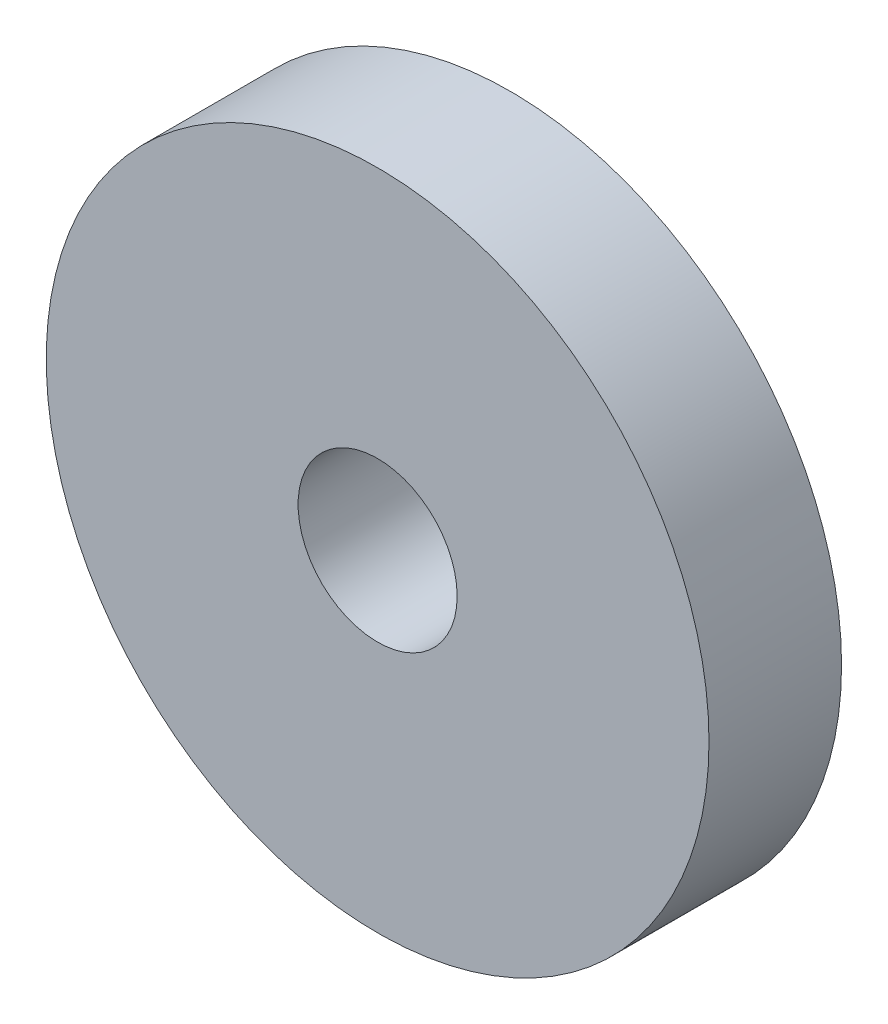
ISO-10303-21;
HEADER;
FILE_DESCRIPTION(('STEP AP214'),'2;1');
FILE_NAME('part.step','',(''),(''),'','','');
FILE_SCHEMA(('AUTOMOTIVE_DESIGN { 1 0 10303 214 1 1 1 1 }'));
ENDSEC;
DATA;
#1=APPLICATION_CONTEXT('core data for automotive mechanical design processes');
#2=APPLICATION_PROTOCOL_DEFINITION('international standard','automotive_design',2000,#1);
#3=PRODUCT_CONTEXT('',#1,'mechanical');
#4=PRODUCT('Part','Part','',(#3));
#5=PRODUCT_RELATED_PRODUCT_CATEGORY('part','',(#4));
#6=PRODUCT_DEFINITION_FORMATION('','',#4);
#7=PRODUCT_DEFINITION_CONTEXT('part definition',#1,'design');
#8=PRODUCT_DEFINITION('design','',#6,#7);
#9=PRODUCT_DEFINITION_SHAPE('','',#8);
#10=(LENGTH_UNIT() NAMED_UNIT(*) SI_UNIT(.MILLI.,.METRE.));
#11=(NAMED_UNIT(*) PLANE_ANGLE_UNIT() SI_UNIT($,.RADIAN.));
#12=(NAMED_UNIT(*) SI_UNIT($,.STERADIAN.) SOLID_ANGLE_UNIT());
#13=UNCERTAINTY_MEASURE_WITH_UNIT(LENGTH_MEASURE(1.E-05),#10,'distance_accuracy_value','');
#14=(GEOMETRIC_REPRESENTATION_CONTEXT(3) GLOBAL_UNCERTAINTY_ASSIGNED_CONTEXT((#13)) GLOBAL_UNIT_ASSIGNED_CONTEXT((#10,
#11,#12)) REPRESENTATION_CONTEXT('',''));
#15=CARTESIAN_POINT('',(0.,0.,0.));
#16=DIRECTION('',(0.,0.,1.));
#17=DIRECTION('',(1.,0.,0.));
#18=AXIS2_PLACEMENT_3D('',#15,#16,#17);
#19=CARTESIAN_POINT('',(0.,0.,5.));
#20=DIRECTION('',(0.,0.,1.));
#21=DIRECTION('',(1.,0.,0.));
#22=AXIS2_PLACEMENT_3D('',#19,#20,#21);
#23=PLANE('',#22);
#24=CARTESIAN_POINT('',(0.,0.,5.));
#25=DIRECTION('',(0.,0.,1.));
#26=DIRECTION('',(1.,0.,0.));
#27=AXIS2_PLACEMENT_3D('',#24,#25,#26);
#28=CIRCLE('',#27,12.5);
#29=CARTESIAN_POINT('',(12.5,0.,5.));
#30=VERTEX_POINT('',#29);
#31=EDGE_CURVE('E10',#30,#30,#28,.T.);
#32=ORIENTED_EDGE('',*,*,#31,.T.);
#33=EDGE_LOOP('',(#32));
#34=FACE_BOUND('',#33,.T.);
#35=CARTESIAN_POINT('',(0.,0.,5.));
#36=DIRECTION('',(0.,0.,1.));
#37=DIRECTION('',(1.,0.,0.));
#38=AXIS2_PLACEMENT_3D('',#35,#36,#37);
#39=CIRCLE('',#38,3.);
#40=CARTESIAN_POINT('',(3.,0.,5.));
#41=VERTEX_POINT('',#40);
#42=EDGE_CURVE('E42',#41,#41,#39,.T.);
#43=ORIENTED_EDGE('',*,*,#42,.F.);
#44=EDGE_LOOP('',(#43));
#45=FACE_BOUND('',#44,.T.);
#46=ADVANCED_FACE('F31',(#34,#45),#23,.T.);
#47=CARTESIAN_POINT('',(0.,0.,0.));
#48=DIRECTION('',(0.,0.,1.));
#49=DIRECTION('',(1.,0.,0.));
#50=AXIS2_PLACEMENT_3D('',#47,#48,#49);
#51=PLANE('',#50);
#52=CARTESIAN_POINT('',(0.,0.,0.));
#53=DIRECTION('',(0.,0.,1.));
#54=DIRECTION('',(1.,0.,0.));
#55=AXIS2_PLACEMENT_3D('',#52,#53,#54);
#56=CIRCLE('',#55,12.5);
#57=CARTESIAN_POINT('',(12.5,0.,0.));
#58=VERTEX_POINT('',#57);
#59=EDGE_CURVE('E35',#58,#58,#56,.T.);
#60=ORIENTED_EDGE('',*,*,#59,.F.);
#61=EDGE_LOOP('',(#60));
#62=FACE_BOUND('',#61,.T.);
#63=CARTESIAN_POINT('',(0.,0.,0.));
#64=DIRECTION('',(0.,0.,1.));
#65=DIRECTION('',(1.,0.,0.));
#66=AXIS2_PLACEMENT_3D('',#63,#64,#65);
#67=CIRCLE('',#66,3.);
#68=CARTESIAN_POINT('',(3.,0.,0.));
#69=VERTEX_POINT('',#68);
#70=EDGE_CURVE('E44',#69,#69,#67,.T.);
#71=ORIENTED_EDGE('',*,*,#70,.T.);
#72=EDGE_LOOP('',(#71));
#73=FACE_BOUND('',#72,.T.);
#74=ADVANCED_FACE('F54',(#62,#73),#51,.F.);
#75=CARTESIAN_POINT('',(0.,0.,5.));
#76=DIRECTION('',(0.,0.,-1.));
#77=DIRECTION('',(-1.,0.,0.));
#78=AXIS2_PLACEMENT_3D('',#75,#76,#77);
#79=CYLINDRICAL_SURFACE('',#78,12.5);
#80=ORIENTED_EDGE('',*,*,#31,.F.);
#81=EDGE_LOOP('',(#80));
#82=FACE_BOUND('',#81,.T.);
#83=ORIENTED_EDGE('',*,*,#59,.T.);
#84=EDGE_LOOP('',(#83));
#85=FACE_BOUND('',#84,.T.);
#86=ADVANCED_FACE('F33',(#82,#85),#79,.T.);
#87=CARTESIAN_POINT('',(0.,0.,5.));
#88=DIRECTION('',(0.,0.,-1.));
#89=DIRECTION('',(-1.,0.,0.));
#90=AXIS2_PLACEMENT_3D('',#87,#88,#89);
#91=CYLINDRICAL_SURFACE('',#90,3.);
#92=ORIENTED_EDGE('',*,*,#42,.T.);
#93=EDGE_LOOP('',(#92));
#94=FACE_BOUND('',#93,.T.);
#95=ORIENTED_EDGE('',*,*,#70,.F.);
#96=EDGE_LOOP('',(#95));
#97=FACE_BOUND('',#96,.T.);
#98=ADVANCED_FACE('F50',(#94,#97),#91,.F.);
#99=CLOSED_SHELL('',(#46,#74,#86,#98));
#100=MANIFOLD_SOLID_BREP('B2',#99);
#101=ADVANCED_BREP_SHAPE_REPRESENTATION('',(#18,#100),#14);
#102=SHAPE_DEFINITION_REPRESENTATION(#9,#101);
ENDSEC;
END-ISO-10303-21;
